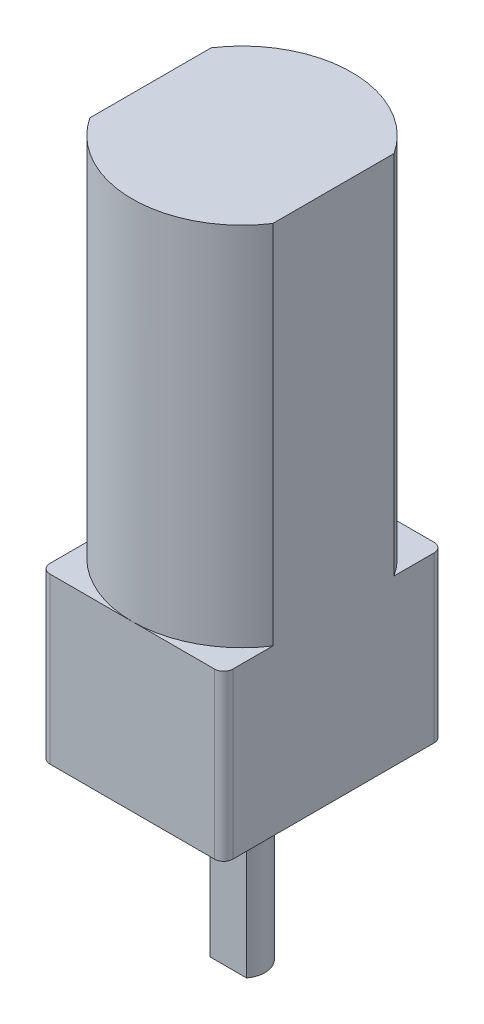
ISO-10303-21;
HEADER;
FILE_DESCRIPTION(('STEP AP214'),'2;1');
FILE_NAME('part.step','',(''),(''),'','','');
FILE_SCHEMA(('AUTOMOTIVE_DESIGN { 1 0 10303 214 1 1 1 1 }'));
ENDSEC;
DATA;
#1=APPLICATION_CONTEXT('core data for automotive mechanical design processes');
#2=APPLICATION_PROTOCOL_DEFINITION('international standard','automotive_design',2000,#1);
#3=PRODUCT_CONTEXT('',#1,'mechanical');
#4=PRODUCT('Part','Part','',(#3));
#5=PRODUCT_RELATED_PRODUCT_CATEGORY('part','',(#4));
#6=PRODUCT_DEFINITION_FORMATION('','',#4);
#7=PRODUCT_DEFINITION_CONTEXT('part definition',#1,'design');
#8=PRODUCT_DEFINITION('design','',#6,#7);
#9=PRODUCT_DEFINITION_SHAPE('','',#8);
#10=(LENGTH_UNIT() NAMED_UNIT(*) SI_UNIT(.MILLI.,.METRE.));
#11=(NAMED_UNIT(*) PLANE_ANGLE_UNIT() SI_UNIT($,.RADIAN.));
#12=(NAMED_UNIT(*) SI_UNIT($,.STERADIAN.) SOLID_ANGLE_UNIT());
#13=UNCERTAINTY_MEASURE_WITH_UNIT(LENGTH_MEASURE(1.E-05),#10,'distance_accuracy_value','');
#14=(GEOMETRIC_REPRESENTATION_CONTEXT(3) GLOBAL_UNCERTAINTY_ASSIGNED_CONTEXT((#13)) GLOBAL_UNIT_ASSIGNED_CONTEXT((#10,
#11,#12)) REPRESENTATION_CONTEXT('',''));
#15=CARTESIAN_POINT('',(0.,0.,0.));
#16=DIRECTION('',(0.,0.,1.));
#17=DIRECTION('',(1.,0.,0.));
#18=AXIS2_PLACEMENT_3D('',#15,#16,#17);
#19=CARTESIAN_POINT('',(0.,0.,0.));
#20=DIRECTION('',(0.,-1.,0.));
#21=DIRECTION('',(0.,0.,-1.));
#22=AXIS2_PLACEMENT_3D('',#19,#20,#21);
#23=PLANE('',#22);
#24=DIRECTION('',(0.,0.,1.));
#25=VECTOR('',#24,1.);
#26=CARTESIAN_POINT('',(0.,0.,0.));
#27=LINE('',#26,#25);
#28=CARTESIAN_POINT('',(0.,0.,9.3166247903554));
#29=VERTEX_POINT('',#28);
#30=CARTESIAN_POINT('',(0.,0.,11.5));
#31=VERTEX_POINT('',#30);
#32=EDGE_CURVE('E235',#29,#31,#27,.T.);
#33=ORIENTED_EDGE('',*,*,#32,.F.);
#34=CARTESIAN_POINT('',(-5.,0.,6.));
#35=DIRECTION('',(0.,1.,0.));
#36=DIRECTION('',(0.,0.,1.));
#37=AXIS2_PLACEMENT_3D('',#34,#35,#36);
#38=CIRCLE('',#37,6.);
#39=CARTESIAN_POINT('',(-5.,0.,12.));
#40=VERTEX_POINT('',#39);
#41=EDGE_CURVE('E56',#29,#40,#38,.F.);
#42=ORIENTED_EDGE('',*,*,#41,.T.);
#43=DIRECTION('',(-1.,0.,0.));
#44=VECTOR('',#43,1.);
#45=CARTESIAN_POINT('',(0.,0.,12.));
#46=LINE('',#45,#44);
#47=CARTESIAN_POINT('',(-0.499999999999999,0.,12.));
#48=VERTEX_POINT('',#47);
#49=EDGE_CURVE('E224',#48,#40,#46,.T.);
#50=ORIENTED_EDGE('',*,*,#49,.F.);
#51=CARTESIAN_POINT('',(-0.499999999999999,0.,11.5));
#52=DIRECTION('',(0.,-1.,0.));
#53=DIRECTION('',(0.,0.,-1.));
#54=AXIS2_PLACEMENT_3D('',#51,#52,#53);
#55=CIRCLE('',#54,0.5);
#56=EDGE_CURVE('E265',#48,#31,#55,.F.);
#57=ORIENTED_EDGE('',*,*,#56,.T.);
#58=EDGE_LOOP('',(#33,#42,#50,#57));
#59=FACE_BOUND('',#58,.T.);
#60=ADVANCED_FACE('F45',(#59),#23,.F.);
#61=CARTESIAN_POINT('',(-9.5,0.,12.));
#62=VERTEX_POINT('',#61);
#63=EDGE_CURVE('E207',#40,#62,#46,.T.);
#64=ORIENTED_EDGE('',*,*,#63,.F.);
#65=CARTESIAN_POINT('',(-10.,0.,9.3166247903554));
#66=VERTEX_POINT('',#65);
#67=EDGE_CURVE('E12',#40,#66,#38,.F.);
#68=ORIENTED_EDGE('',*,*,#67,.T.);
#69=DIRECTION('',(0.,0.,1.));
#70=VECTOR('',#69,1.);
#71=CARTESIAN_POINT('',(-10.,0.,0.));
#72=LINE('',#71,#70);
#73=CARTESIAN_POINT('',(-10.,0.,11.5));
#74=VERTEX_POINT('',#73);
#75=EDGE_CURVE('E227',#66,#74,#72,.T.);
#76=ORIENTED_EDGE('',*,*,#75,.T.);
#77=CARTESIAN_POINT('',(-9.5,0.,11.5));
#78=DIRECTION('',(0.,-1.,0.));
#79=DIRECTION('',(0.,0.,-1.));
#80=AXIS2_PLACEMENT_3D('',#77,#78,#79);
#81=CIRCLE('',#80,0.5);
#82=EDGE_CURVE('E241',#74,#62,#81,.F.);
#83=ORIENTED_EDGE('',*,*,#82,.T.);
#84=EDGE_LOOP('',(#64,#68,#76,#83));
#85=FACE_BOUND('',#84,.T.);
#86=ADVANCED_FACE('F302',(#85),#23,.F.);
#87=CARTESIAN_POINT('',(-10.,0.,0.5));
#88=VERTEX_POINT('',#87);
#89=CARTESIAN_POINT('',(-10.,0.,2.6833752096446));
#90=VERTEX_POINT('',#89);
#91=EDGE_CURVE('E228',#88,#90,#72,.T.);
#92=ORIENTED_EDGE('',*,*,#91,.T.);
#93=CARTESIAN_POINT('',(-5.,0.,6.));
#94=DIRECTION('',(0.,1.,0.));
#95=DIRECTION('',(0.,0.,1.));
#96=AXIS2_PLACEMENT_3D('',#93,#94,#95);
#97=CIRCLE('',#96,6.);
#98=CARTESIAN_POINT('',(-5.,0.,0.));
#99=VERTEX_POINT('',#98);
#100=EDGE_CURVE('E178',#90,#99,#97,.F.);
#101=ORIENTED_EDGE('',*,*,#100,.T.);
#102=DIRECTION('',(-1.,0.,0.));
#103=VECTOR('',#102,1.);
#104=CARTESIAN_POINT('',(0.,0.,0.));
#105=LINE('',#104,#103);
#106=CARTESIAN_POINT('',(-9.5,0.,0.));
#107=VERTEX_POINT('',#106);
#108=EDGE_CURVE('E231',#99,#107,#105,.T.);
#109=ORIENTED_EDGE('',*,*,#108,.T.);
#110=CARTESIAN_POINT('',(-9.5,0.,0.5));
#111=DIRECTION('',(0.,-1.,0.));
#112=DIRECTION('',(0.,0.,-1.));
#113=AXIS2_PLACEMENT_3D('',#110,#111,#112);
#114=CIRCLE('',#113,0.5);
#115=EDGE_CURVE('E262',#107,#88,#114,.F.);
#116=ORIENTED_EDGE('',*,*,#115,.T.);
#117=EDGE_LOOP('',(#92,#101,#109,#116));
#118=FACE_BOUND('',#117,.T.);
#119=ADVANCED_FACE('F295',(#118),#23,.F.);
#120=CARTESIAN_POINT('',(0.,15.,0.));
#121=DIRECTION('',(-1.,0.,0.));
#122=DIRECTION('',(0.,0.,1.));
#123=AXIS2_PLACEMENT_3D('',#120,#121,#122);
#124=PLANE('',#123);
#125=DIRECTION('',(0.,1.,0.));
#126=VECTOR('',#125,1.);
#127=CARTESIAN_POINT('',(0.,15.,0.5));
#128=LINE('',#127,#126);
#129=CARTESIAN_POINT('',(0.,-9.,0.5));
#130=VERTEX_POINT('',#129);
#131=CARTESIAN_POINT('',(0.,0.,0.5));
#132=VERTEX_POINT('',#131);
#133=EDGE_CURVE('E268',#130,#132,#128,.T.);
#134=ORIENTED_EDGE('',*,*,#133,.T.);
#135=CARTESIAN_POINT('',(0.,0.,2.68337520964461));
#136=VERTEX_POINT('',#135);
#137=EDGE_CURVE('E214',#132,#136,#27,.T.);
#138=ORIENTED_EDGE('',*,*,#137,.T.);
#139=DIRECTION('',(0.,-1.,0.));
#140=VECTOR('',#139,1.);
#141=CARTESIAN_POINT('',(0.,20.,2.68337520964461));
#142=LINE('',#141,#140);
#143=CARTESIAN_POINT('',(0.,20.,2.68337520964461));
#144=VERTEX_POINT('',#143);
#145=EDGE_CURVE('E63',#144,#136,#142,.T.);
#146=ORIENTED_EDGE('',*,*,#145,.F.);
#147=DIRECTION('',(0.,0.,-1.));
#148=VECTOR('',#147,1.);
#149=CARTESIAN_POINT('',(0.,20.,0.));
#150=LINE('',#149,#148);
#151=CARTESIAN_POINT('',(0.,20.,9.3166247903554));
#152=VERTEX_POINT('',#151);
#153=EDGE_CURVE('E166',#152,#144,#150,.T.);
#154=ORIENTED_EDGE('',*,*,#153,.F.);
#155=DIRECTION('',(0.,-1.,0.));
#156=VECTOR('',#155,1.);
#157=CARTESIAN_POINT('',(0.,20.,9.3166247903554));
#158=LINE('',#157,#156);
#159=EDGE_CURVE('E156',#152,#29,#158,.T.);
#160=ORIENTED_EDGE('',*,*,#159,.T.);
#161=ORIENTED_EDGE('',*,*,#32,.T.);
#162=DIRECTION('',(0.,1.,0.));
#163=VECTOR('',#162,1.);
#164=CARTESIAN_POINT('',(0.,15.,11.5));
#165=LINE('',#164,#163);
#166=CARTESIAN_POINT('',(0.,-9.,11.5));
#167=VERTEX_POINT('',#166);
#168=EDGE_CURVE('E269',#31,#167,#165,.F.);
#169=ORIENTED_EDGE('',*,*,#168,.T.);
#170=DIRECTION('',(0.,0.,1.));
#171=VECTOR('',#170,1.);
#172=CARTESIAN_POINT('',(0.,-9.,0.));
#173=LINE('',#172,#171);
#174=EDGE_CURVE('E220',#130,#167,#173,.T.);
#175=ORIENTED_EDGE('',*,*,#174,.F.);
#176=EDGE_LOOP('',(#134,#138,#146,#154,#160,#161,#169,#175));
#177=FACE_BOUND('',#176,.T.);
#178=ADVANCED_FACE('F168',(#177),#124,.F.);
#179=CARTESIAN_POINT('',(0.,15.,0.));
#180=DIRECTION('',(0.,0.,1.));
#181=DIRECTION('',(1.,0.,0.));
#182=AXIS2_PLACEMENT_3D('',#179,#180,#181);
#183=PLANE('',#182);
#184=CARTESIAN_POINT('',(-0.5,0.,0.));
#185=VERTEX_POINT('',#184);
#186=EDGE_CURVE('E232',#185,#99,#105,.T.);
#187=ORIENTED_EDGE('',*,*,#186,.F.);
#188=DIRECTION('',(0.,1.,0.));
#189=VECTOR('',#188,1.);
#190=CARTESIAN_POINT('',(-0.5,15.,0.));
#191=LINE('',#190,#189);
#192=CARTESIAN_POINT('',(-0.5,-9.,0.));
#193=VERTEX_POINT('',#192);
#194=EDGE_CURVE('E257',#185,#193,#191,.F.);
#195=ORIENTED_EDGE('',*,*,#194,.T.);
#196=DIRECTION('',(-1.,0.,0.));
#197=VECTOR('',#196,1.);
#198=CARTESIAN_POINT('',(0.,-9.,0.));
#199=LINE('',#198,#197);
#200=CARTESIAN_POINT('',(-9.5,-9.,0.));
#201=VERTEX_POINT('',#200);
#202=EDGE_CURVE('E217',#193,#201,#199,.T.);
#203=ORIENTED_EDGE('',*,*,#202,.T.);
#204=DIRECTION('',(0.,1.,0.));
#205=VECTOR('',#204,1.);
#206=CARTESIAN_POINT('',(-9.5,15.,0.));
#207=LINE('',#206,#205);
#208=EDGE_CURVE('E259',#201,#107,#207,.T.);
#209=ORIENTED_EDGE('',*,*,#208,.T.);
#210=ORIENTED_EDGE('',*,*,#108,.F.);
#211=EDGE_LOOP('',(#187,#195,#203,#209,#210));
#212=FACE_BOUND('',#211,.T.);
#213=ADVANCED_FACE('F283',(#212),#183,.F.);
#214=CARTESIAN_POINT('',(-10.,15.,0.));
#215=DIRECTION('',(1.,0.,0.));
#216=DIRECTION('',(0.,0.,-1.));
#217=AXIS2_PLACEMENT_3D('',#214,#215,#216);
#218=PLANE('',#217);
#219=ORIENTED_EDGE('',*,*,#91,.F.);
#220=DIRECTION('',(0.,1.,0.));
#221=VECTOR('',#220,1.);
#222=CARTESIAN_POINT('',(-10.,15.,0.5));
#223=LINE('',#222,#221);
#224=CARTESIAN_POINT('',(-10.,-9.,0.5));
#225=VERTEX_POINT('',#224);
#226=EDGE_CURVE('E223',#88,#225,#223,.F.);
#227=ORIENTED_EDGE('',*,*,#226,.T.);
#228=DIRECTION('',(0.,0.,1.));
#229=VECTOR('',#228,1.);
#230=CARTESIAN_POINT('',(-10.,-9.,0.));
#231=LINE('',#230,#229);
#232=CARTESIAN_POINT('',(-10.,-9.,11.5));
#233=VERTEX_POINT('',#232);
#234=EDGE_CURVE('E213',#225,#233,#231,.T.);
#235=ORIENTED_EDGE('',*,*,#234,.T.);
#236=DIRECTION('',(0.,1.,0.));
#237=VECTOR('',#236,1.);
#238=CARTESIAN_POINT('',(-10.,15.,11.5));
#239=LINE('',#238,#237);
#240=EDGE_CURVE('E238',#233,#74,#239,.T.);
#241=ORIENTED_EDGE('',*,*,#240,.T.);
#242=ORIENTED_EDGE('',*,*,#75,.F.);
#243=DIRECTION('',(0.,-1.,0.));
#244=VECTOR('',#243,1.);
#245=CARTESIAN_POINT('',(-10.,20.,9.3166247903554));
#246=LINE('',#245,#244);
#247=CARTESIAN_POINT('',(-10.,20.,9.3166247903554));
#248=VERTEX_POINT('',#247);
#249=EDGE_CURVE('E184',#248,#66,#246,.T.);
#250=ORIENTED_EDGE('',*,*,#249,.F.);
#251=DIRECTION('',(0.,0.,1.));
#252=VECTOR('',#251,1.);
#253=CARTESIAN_POINT('',(-10.,20.,0.));
#254=LINE('',#253,#252);
#255=CARTESIAN_POINT('',(-10.,20.,2.6833752096446));
#256=VERTEX_POINT('',#255);
#257=EDGE_CURVE('E176',#256,#248,#254,.T.);
#258=ORIENTED_EDGE('',*,*,#257,.F.);
#259=DIRECTION('',(0.,-1.,0.));
#260=VECTOR('',#259,1.);
#261=CARTESIAN_POINT('',(-10.,20.,2.6833752096446));
#262=LINE('',#261,#260);
#263=EDGE_CURVE('E187',#256,#90,#262,.T.);
#264=ORIENTED_EDGE('',*,*,#263,.T.);
#265=EDGE_LOOP('',(#219,#227,#235,#241,#242,#250,#258,#264));
#266=FACE_BOUND('',#265,.T.);
#267=ADVANCED_FACE('F298',(#266),#218,.F.);
#268=CARTESIAN_POINT('',(0.,15.,12.));
#269=DIRECTION('',(0.,0.,-1.));
#270=DIRECTION('',(-1.,0.,0.));
#271=AXIS2_PLACEMENT_3D('',#268,#269,#270);
#272=PLANE('',#271);
#273=DIRECTION('',(0.,1.,0.));
#274=VECTOR('',#273,1.);
#275=CARTESIAN_POINT('',(-0.499999999999999,15.,12.));
#276=LINE('',#275,#274);
#277=CARTESIAN_POINT('',(-0.499999999999999,-9.,12.));
#278=VERTEX_POINT('',#277);
#279=EDGE_CURVE('E244',#278,#48,#276,.T.);
#280=ORIENTED_EDGE('',*,*,#279,.T.);
#281=ORIENTED_EDGE('',*,*,#49,.T.);
#282=ORIENTED_EDGE('',*,*,#63,.T.);
#283=DIRECTION('',(0.,1.,0.));
#284=VECTOR('',#283,1.);
#285=CARTESIAN_POINT('',(-9.5,15.,12.));
#286=LINE('',#285,#284);
#287=CARTESIAN_POINT('',(-9.5,-9.,12.));
#288=VERTEX_POINT('',#287);
#289=EDGE_CURVE('E247',#62,#288,#286,.F.);
#290=ORIENTED_EDGE('',*,*,#289,.T.);
#291=DIRECTION('',(-1.,0.,0.));
#292=VECTOR('',#291,1.);
#293=CARTESIAN_POINT('',(0.,-9.,12.));
#294=LINE('',#293,#292);
#295=EDGE_CURVE('E210',#278,#288,#294,.T.);
#296=ORIENTED_EDGE('',*,*,#295,.F.);
#297=EDGE_LOOP('',(#280,#281,#282,#290,#296));
#298=FACE_BOUND('',#297,.T.);
#299=ADVANCED_FACE('F306',(#298),#272,.F.);
#300=CARTESIAN_POINT('',(-5.,-19.,6.));
#301=DIRECTION('',(0.,1.,0.));
#302=DIRECTION('',(0.,0.,1.));
#303=AXIS2_PLACEMENT_3D('',#300,#301,#302);
#304=CYLINDRICAL_SURFACE('',#303,1.25);
#305=DIRECTION('',(0.,-1.,0.));
#306=VECTOR('',#305,1.);
#307=CARTESIAN_POINT('',(-4.,-9.8,6.75));
#308=LINE('',#307,#306);
#309=CARTESIAN_POINT('',(-4.,-9.8,6.75));
#310=VERTEX_POINT('',#309);
#311=CARTESIAN_POINT('',(-4.,-19.,6.75));
#312=VERTEX_POINT('',#311);
#313=EDGE_CURVE('E192',#310,#312,#308,.T.);
#314=ORIENTED_EDGE('',*,*,#313,.T.);
#315=CARTESIAN_POINT('',(-5.,-19.,6.));
#316=DIRECTION('',(0.,-1.,0.));
#317=DIRECTION('',(0.,0.,-1.));
#318=AXIS2_PLACEMENT_3D('',#315,#316,#317);
#319=CIRCLE('',#318,1.25);
#320=CARTESIAN_POINT('',(-6.,-19.,6.75));
#321=VERTEX_POINT('',#320);
#322=EDGE_CURVE('E195',#321,#312,#319,.T.);
#323=ORIENTED_EDGE('',*,*,#322,.F.);
#324=DIRECTION('',(0.,-1.,0.));
#325=VECTOR('',#324,1.);
#326=CARTESIAN_POINT('',(-6.,-9.8,6.75));
#327=LINE('',#326,#325);
#328=CARTESIAN_POINT('',(-6.,-9.8,6.75));
#329=VERTEX_POINT('',#328);
#330=EDGE_CURVE('E71',#329,#321,#327,.T.);
#331=ORIENTED_EDGE('',*,*,#330,.F.);
#332=CARTESIAN_POINT('',(-5.,-9.8,6.));
#333=DIRECTION('',(0.,-1.,0.));
#334=DIRECTION('',(0.,0.,-1.));
#335=AXIS2_PLACEMENT_3D('',#332,#333,#334);
#336=CIRCLE('',#335,1.25);
#337=EDGE_CURVE('E200',#329,#310,#336,.T.);
#338=ORIENTED_EDGE('',*,*,#337,.T.);
#339=EDGE_LOOP('',(#314,#323,#331,#338));
#340=FACE_BOUND('',#339,.T.);
#341=ADVANCED_FACE('F339',(#340),#304,.T.);
#342=CARTESIAN_POINT('',(-5.,-19.,6.));
#343=DIRECTION('',(0.,-1.,0.));
#344=DIRECTION('',(0.,0.,-1.));
#345=AXIS2_PLACEMENT_3D('',#342,#343,#344);
#346=PLANE('',#345);
#347=ORIENTED_EDGE('',*,*,#322,.T.);
#348=DIRECTION('',(-1.,0.,0.));
#349=VECTOR('',#348,1.);
#350=CARTESIAN_POINT('',(0.,-19.,6.75));
#351=LINE('',#350,#349);
#352=EDGE_CURVE('E164',#312,#321,#351,.T.);
#353=ORIENTED_EDGE('',*,*,#352,.T.);
#354=EDGE_LOOP('',(#347,#353));
#355=FACE_BOUND('',#354,.T.);
#356=ADVANCED_FACE('F335',(#355),#346,.T.);
#357=ORIENTED_EDGE('',*,*,#186,.T.);
#358=EDGE_CURVE('E54',#99,#136,#97,.F.);
#359=ORIENTED_EDGE('',*,*,#358,.T.);
#360=ORIENTED_EDGE('',*,*,#137,.F.);
#361=CARTESIAN_POINT('',(-0.5,0.,0.5));
#362=DIRECTION('',(0.,-1.,0.));
#363=DIRECTION('',(0.,0.,-1.));
#364=AXIS2_PLACEMENT_3D('',#361,#362,#363);
#365=CIRCLE('',#364,0.5);
#366=EDGE_CURVE('E49',#132,#185,#365,.F.);
#367=ORIENTED_EDGE('',*,*,#366,.T.);
#368=EDGE_LOOP('',(#357,#359,#360,#367));
#369=FACE_BOUND('',#368,.T.);
#370=ADVANCED_FACE('F276',(#369),#23,.F.);
#371=CARTESIAN_POINT('',(0.,-9.,0.));
#372=DIRECTION('',(0.,-1.,0.));
#373=DIRECTION('',(0.,0.,-1.));
#374=AXIS2_PLACEMENT_3D('',#371,#372,#373);
#375=PLANE('',#374);
#376=CARTESIAN_POINT('',(-5.,-9.,6.));
#377=DIRECTION('',(0.,-1.,0.));
#378=DIRECTION('',(0.,0.,-1.));
#379=AXIS2_PLACEMENT_3D('',#376,#377,#378);
#380=CIRCLE('',#379,2.);
#381=CARTESIAN_POINT('',(-5.,-9.,4.));
#382=VERTEX_POINT('',#381);
#383=EDGE_CURVE('E203',#382,#382,#380,.T.);
#384=ORIENTED_EDGE('',*,*,#383,.F.);
#385=EDGE_LOOP('',(#384));
#386=FACE_BOUND('',#385,.T.);
#387=ORIENTED_EDGE('',*,*,#295,.T.);
#388=CARTESIAN_POINT('',(-9.5,-9.,11.5));
#389=DIRECTION('',(0.,-1.,0.));
#390=DIRECTION('',(0.,0.,-1.));
#391=AXIS2_PLACEMENT_3D('',#388,#389,#390);
#392=CIRCLE('',#391,0.5);
#393=EDGE_CURVE('E255',#288,#233,#392,.T.);
#394=ORIENTED_EDGE('',*,*,#393,.T.);
#395=ORIENTED_EDGE('',*,*,#234,.F.);
#396=CARTESIAN_POINT('',(-9.5,-9.,0.5));
#397=DIRECTION('',(0.,-1.,0.));
#398=DIRECTION('',(0.,0.,-1.));
#399=AXIS2_PLACEMENT_3D('',#396,#397,#398);
#400=CIRCLE('',#399,0.5);
#401=EDGE_CURVE('E253',#225,#201,#400,.T.);
#402=ORIENTED_EDGE('',*,*,#401,.T.);
#403=ORIENTED_EDGE('',*,*,#202,.F.);
#404=CARTESIAN_POINT('',(-0.5,-9.,0.5));
#405=DIRECTION('',(0.,-1.,0.));
#406=DIRECTION('',(0.,0.,-1.));
#407=AXIS2_PLACEMENT_3D('',#404,#405,#406);
#408=CIRCLE('',#407,0.5);
#409=EDGE_CURVE('E249',#193,#130,#408,.T.);
#410=ORIENTED_EDGE('',*,*,#409,.T.);
#411=ORIENTED_EDGE('',*,*,#174,.T.);
#412=CARTESIAN_POINT('',(-0.499999999999999,-9.,11.5));
#413=DIRECTION('',(0.,-1.,0.));
#414=DIRECTION('',(0.,0.,-1.));
#415=AXIS2_PLACEMENT_3D('',#412,#413,#414);
#416=CIRCLE('',#415,0.5);
#417=EDGE_CURVE('E251',#167,#278,#416,.T.);
#418=ORIENTED_EDGE('',*,*,#417,.T.);
#419=EDGE_LOOP('',(#387,#394,#395,#402,#403,#410,#411,#418));
#420=FACE_BOUND('',#419,.T.);
#421=ADVANCED_FACE('F287',(#386,#420),#375,.T.);
#422=CARTESIAN_POINT('',(-9.5,15.,11.5));
#423=DIRECTION('',(0.,1.,0.));
#424=DIRECTION('',(0.,0.,1.));
#425=AXIS2_PLACEMENT_3D('',#422,#423,#424);
#426=CYLINDRICAL_SURFACE('',#425,0.5);
#427=ORIENTED_EDGE('',*,*,#393,.F.);
#428=ORIENTED_EDGE('',*,*,#289,.F.);
#429=ORIENTED_EDGE('',*,*,#82,.F.);
#430=ORIENTED_EDGE('',*,*,#240,.F.);
#431=EDGE_LOOP('',(#427,#428,#429,#430));
#432=FACE_BOUND('',#431,.T.);
#433=ADVANCED_FACE('F316',(#432),#426,.T.);
#434=CARTESIAN_POINT('',(-9.5,15.,0.5));
#435=DIRECTION('',(0.,1.,0.));
#436=DIRECTION('',(0.,0.,1.));
#437=AXIS2_PLACEMENT_3D('',#434,#435,#436);
#438=CYLINDRICAL_SURFACE('',#437,0.5);
#439=ORIENTED_EDGE('',*,*,#401,.F.);
#440=ORIENTED_EDGE('',*,*,#226,.F.);
#441=ORIENTED_EDGE('',*,*,#115,.F.);
#442=ORIENTED_EDGE('',*,*,#208,.F.);
#443=EDGE_LOOP('',(#439,#440,#441,#442));
#444=FACE_BOUND('',#443,.T.);
#445=ADVANCED_FACE('F292',(#444),#438,.T.);
#446=CARTESIAN_POINT('',(-0.499999999999999,15.,11.5));
#447=DIRECTION('',(0.,1.,0.));
#448=DIRECTION('',(0.,0.,1.));
#449=AXIS2_PLACEMENT_3D('',#446,#447,#448);
#450=CYLINDRICAL_SURFACE('',#449,0.5);
#451=ORIENTED_EDGE('',*,*,#417,.F.);
#452=ORIENTED_EDGE('',*,*,#168,.F.);
#453=ORIENTED_EDGE('',*,*,#56,.F.);
#454=ORIENTED_EDGE('',*,*,#279,.F.);
#455=EDGE_LOOP('',(#451,#452,#453,#454));
#456=FACE_BOUND('',#455,.T.);
#457=ADVANCED_FACE('F313',(#456),#450,.T.);
#458=CARTESIAN_POINT('',(-0.5,15.,0.5));
#459=DIRECTION('',(0.,1.,0.));
#460=DIRECTION('',(0.,0.,1.));
#461=AXIS2_PLACEMENT_3D('',#458,#459,#460);
#462=CYLINDRICAL_SURFACE('',#461,0.5);
#463=ORIENTED_EDGE('',*,*,#409,.F.);
#464=ORIENTED_EDGE('',*,*,#194,.F.);
#465=ORIENTED_EDGE('',*,*,#366,.F.);
#466=ORIENTED_EDGE('',*,*,#133,.F.);
#467=EDGE_LOOP('',(#463,#464,#465,#466));
#468=FACE_BOUND('',#467,.T.);
#469=ADVANCED_FACE('F47',(#468),#462,.T.);
#470=CARTESIAN_POINT('',(-5.,-9.8,6.));
#471=DIRECTION('',(0.,-1.,0.));
#472=DIRECTION('',(0.,0.,-1.));
#473=AXIS2_PLACEMENT_3D('',#470,#471,#472);
#474=PLANE('',#473);
#475=CARTESIAN_POINT('',(-5.,-9.8,6.));
#476=DIRECTION('',(0.,-1.,0.));
#477=DIRECTION('',(0.,0.,-1.));
#478=AXIS2_PLACEMENT_3D('',#475,#476,#477);
#479=CIRCLE('',#478,2.);
#480=CARTESIAN_POINT('',(-5.,-9.8,4.));
#481=VERTEX_POINT('',#480);
#482=EDGE_CURVE('E204',#481,#481,#479,.T.);
#483=ORIENTED_EDGE('',*,*,#482,.T.);
#484=EDGE_LOOP('',(#483));
#485=FACE_BOUND('',#484,.T.);
#486=ORIENTED_EDGE('',*,*,#337,.F.);
#487=DIRECTION('',(-1.,0.,0.));
#488=VECTOR('',#487,1.);
#489=CARTESIAN_POINT('',(0.,-9.8,6.75));
#490=LINE('',#489,#488);
#491=EDGE_CURVE('E190',#310,#329,#490,.T.);
#492=ORIENTED_EDGE('',*,*,#491,.F.);
#493=EDGE_LOOP('',(#486,#492));
#494=FACE_BOUND('',#493,.T.);
#495=ADVANCED_FACE('F362',(#485,#494),#474,.T.);
#496=CARTESIAN_POINT('',(-5.,-9.8,6.));
#497=DIRECTION('',(0.,1.,0.));
#498=DIRECTION('',(0.,0.,1.));
#499=AXIS2_PLACEMENT_3D('',#496,#497,#498);
#500=CYLINDRICAL_SURFACE('',#499,2.);
#501=ORIENTED_EDGE('',*,*,#482,.F.);
#502=EDGE_LOOP('',(#501));
#503=FACE_BOUND('',#502,.T.);
#504=ORIENTED_EDGE('',*,*,#383,.T.);
#505=EDGE_LOOP('',(#504));
#506=FACE_BOUND('',#505,.T.);
#507=ADVANCED_FACE('F365',(#503,#506),#500,.T.);
#508=CARTESIAN_POINT('',(0.,-9.8,6.75));
#509=DIRECTION('',(0.,0.,1.));
#510=DIRECTION('',(1.,0.,0.));
#511=AXIS2_PLACEMENT_3D('',#508,#509,#510);
#512=PLANE('',#511);
#513=ORIENTED_EDGE('',*,*,#352,.F.);
#514=ORIENTED_EDGE('',*,*,#313,.F.);
#515=ORIENTED_EDGE('',*,*,#491,.T.);
#516=ORIENTED_EDGE('',*,*,#330,.T.);
#517=EDGE_LOOP('',(#513,#514,#515,#516));
#518=FACE_BOUND('',#517,.T.);
#519=ADVANCED_FACE('F368',(#518),#512,.T.);
#520=CARTESIAN_POINT('',(-5.,20.,6.));
#521=DIRECTION('',(0.,-1.,0.));
#522=DIRECTION('',(0.,0.,-1.));
#523=AXIS2_PLACEMENT_3D('',#520,#521,#522);
#524=CYLINDRICAL_SURFACE('',#523,6.);
#525=ORIENTED_EDGE('',*,*,#41,.F.);
#526=ORIENTED_EDGE('',*,*,#159,.F.);
#527=CARTESIAN_POINT('',(-5.,20.,6.));
#528=DIRECTION('',(0.,1.,0.));
#529=DIRECTION('',(0.,0.,1.));
#530=AXIS2_PLACEMENT_3D('',#527,#528,#529);
#531=CIRCLE('',#530,6.);
#532=EDGE_CURVE('E160',#152,#248,#531,.F.);
#533=ORIENTED_EDGE('',*,*,#532,.T.);
#534=ORIENTED_EDGE('',*,*,#249,.T.);
#535=ORIENTED_EDGE('',*,*,#67,.F.);
#536=EDGE_LOOP('',(#525,#526,#533,#534,#535));
#537=FACE_BOUND('',#536,.T.);
#538=ADVANCED_FACE('F158',(#537),#524,.T.);
#539=CARTESIAN_POINT('',(-5.,20.,6.));
#540=DIRECTION('',(0.,-1.,0.));
#541=DIRECTION('',(0.,0.,-1.));
#542=AXIS2_PLACEMENT_3D('',#539,#540,#541);
#543=CYLINDRICAL_SURFACE('',#542,6.);
#544=ORIENTED_EDGE('',*,*,#100,.F.);
#545=ORIENTED_EDGE('',*,*,#263,.F.);
#546=CARTESIAN_POINT('',(-5.,20.,6.));
#547=DIRECTION('',(0.,1.,0.));
#548=DIRECTION('',(0.,0.,1.));
#549=AXIS2_PLACEMENT_3D('',#546,#547,#548);
#550=CIRCLE('',#549,6.);
#551=EDGE_CURVE('E172',#256,#144,#550,.F.);
#552=ORIENTED_EDGE('',*,*,#551,.T.);
#553=ORIENTED_EDGE('',*,*,#145,.T.);
#554=ORIENTED_EDGE('',*,*,#358,.F.);
#555=EDGE_LOOP('',(#544,#545,#552,#553,#554));
#556=FACE_BOUND('',#555,.T.);
#557=ADVANCED_FACE('F296',(#556),#543,.T.);
#558=CARTESIAN_POINT('',(0.,20.,0.));
#559=DIRECTION('',(0.,1.,0.));
#560=DIRECTION('',(0.,0.,1.));
#561=AXIS2_PLACEMENT_3D('',#558,#559,#560);
#562=PLANE('',#561);
#563=ORIENTED_EDGE('',*,*,#532,.F.);
#564=ORIENTED_EDGE('',*,*,#153,.T.);
#565=ORIENTED_EDGE('',*,*,#551,.F.);
#566=ORIENTED_EDGE('',*,*,#257,.T.);
#567=EDGE_LOOP('',(#563,#564,#565,#566));
#568=FACE_BOUND('',#567,.T.);
#569=ADVANCED_FACE('F174',(#568),#562,.T.);
#570=CLOSED_SHELL('',(#60,#86,#119,#178,#213,#267,#299,#341,#356,#370,#421,#433,#445,#457,#469,
#495,#507,#519,#538,#557,#569));
#571=MANIFOLD_SOLID_BREP('B2',#570);
#572=ADVANCED_BREP_SHAPE_REPRESENTATION('',(#18,#571),#14);
#573=SHAPE_DEFINITION_REPRESENTATION(#9,#572);
ENDSEC;
END-ISO-10303-21;
